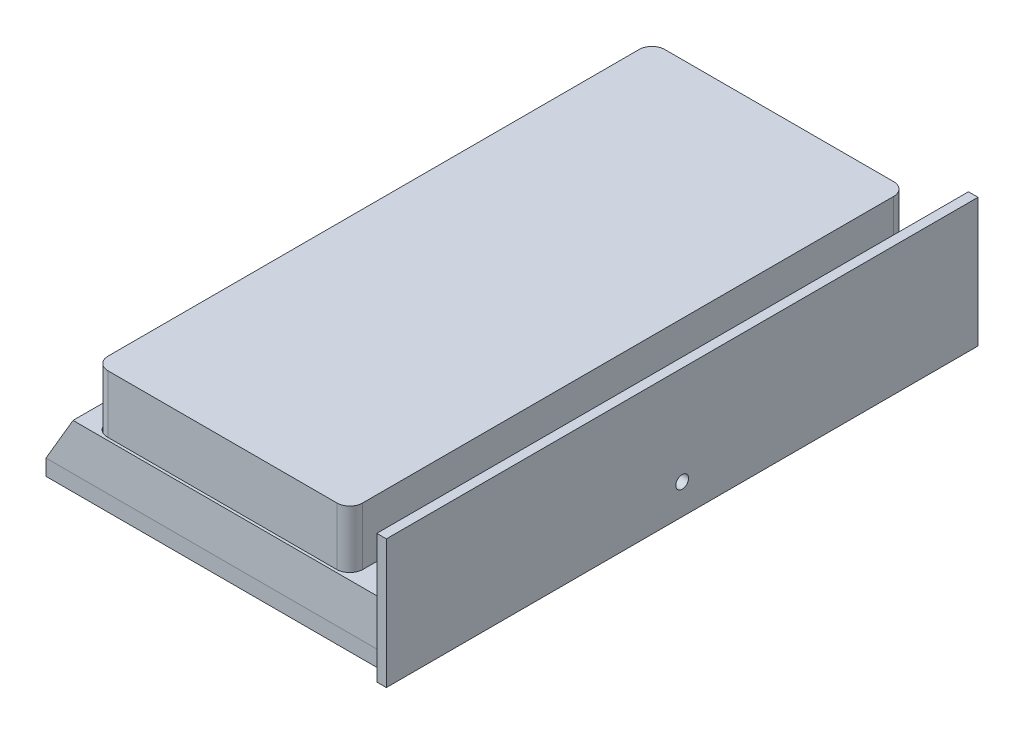
ISO-10303-21;
HEADER;
FILE_DESCRIPTION(('STEP AP214'),'2;1');
FILE_NAME('part.step','',(''),(''),'','','');
FILE_SCHEMA(('AUTOMOTIVE_DESIGN { 1 0 10303 214 1 1 1 1 }'));
ENDSEC;
DATA;
#1=APPLICATION_CONTEXT('core data for automotive mechanical design processes');
#2=APPLICATION_PROTOCOL_DEFINITION('international standard','automotive_design',2000,#1);
#3=PRODUCT_CONTEXT('',#1,'mechanical');
#4=PRODUCT('Part','Part','',(#3));
#5=PRODUCT_RELATED_PRODUCT_CATEGORY('part','',(#4));
#6=PRODUCT_DEFINITION_FORMATION('','',#4);
#7=PRODUCT_DEFINITION_CONTEXT('part definition',#1,'design');
#8=PRODUCT_DEFINITION('design','',#6,#7);
#9=PRODUCT_DEFINITION_SHAPE('','',#8);
#10=(LENGTH_UNIT() NAMED_UNIT(*) SI_UNIT(.MILLI.,.METRE.));
#11=(NAMED_UNIT(*) PLANE_ANGLE_UNIT() SI_UNIT($,.RADIAN.));
#12=(NAMED_UNIT(*) SI_UNIT($,.STERADIAN.) SOLID_ANGLE_UNIT());
#13=UNCERTAINTY_MEASURE_WITH_UNIT(LENGTH_MEASURE(1.E-05),#10,'distance_accuracy_value','');
#14=(GEOMETRIC_REPRESENTATION_CONTEXT(3) GLOBAL_UNCERTAINTY_ASSIGNED_CONTEXT((#13)) GLOBAL_UNIT_ASSIGNED_CONTEXT((#10,
#11,#12)) REPRESENTATION_CONTEXT('',''));
#15=CARTESIAN_POINT('',(0.,0.,0.));
#16=DIRECTION('',(0.,0.,1.));
#17=DIRECTION('',(1.,0.,0.));
#18=AXIS2_PLACEMENT_3D('',#15,#16,#17);
#19=CARTESIAN_POINT('',(0.,15.,0.));
#20=DIRECTION('',(0.,1.,0.));
#21=DIRECTION('',(0.,0.,1.));
#22=AXIS2_PLACEMENT_3D('',#19,#20,#21);
#23=PLANE('',#22);
#24=DIRECTION('',(1.,0.,0.));
#25=VECTOR('',#24,1.);
#26=CARTESIAN_POINT('',(54.,15.,88.5));
#27=LINE('',#26,#25);
#28=CARTESIAN_POINT('',(-46.,15.,88.5));
#29=VERTEX_POINT('',#28);
#30=CARTESIAN_POINT('',(50.,15.,88.5));
#31=VERTEX_POINT('',#30);
#32=EDGE_CURVE('E291',#29,#31,#27,.T.);
#33=ORIENTED_EDGE('',*,*,#32,.T.);
#34=DIRECTION('',(0.,0.,-1.));
#35=VECTOR('',#34,1.);
#36=CARTESIAN_POINT('',(50.,15.,-88.5));
#37=LINE('',#36,#35);
#38=CARTESIAN_POINT('',(50.,15.,-88.5));
#39=VERTEX_POINT('',#38);
#40=EDGE_CURVE('E314',#31,#39,#37,.T.);
#41=ORIENTED_EDGE('',*,*,#40,.T.);
#42=DIRECTION('',(-1.,0.,0.));
#43=VECTOR('',#42,1.);
#44=CARTESIAN_POINT('',(-54.,15.,-88.5));
#45=LINE('',#44,#43);
#46=CARTESIAN_POINT('',(-46.,15.,-88.5));
#47=VERTEX_POINT('',#46);
#48=EDGE_CURVE('E294',#39,#47,#45,.T.);
#49=ORIENTED_EDGE('',*,*,#48,.T.);
#50=DIRECTION('',(0.,0.,1.));
#51=VECTOR('',#50,1.);
#52=CARTESIAN_POINT('',(-46.,15.,88.5));
#53=LINE('',#52,#51);
#54=EDGE_CURVE('E303',#47,#29,#53,.T.);
#55=ORIENTED_EDGE('',*,*,#54,.T.);
#56=EDGE_LOOP('',(#33,#41,#49,#55));
#57=FACE_BOUND('',#56,.T.);
#58=DIRECTION('',(-1.,0.,0.));
#59=VECTOR('',#58,1.);
#60=CARTESIAN_POINT('',(36.,15.,-87.65));
#61=LINE('',#60,#59);
#62=CARTESIAN_POINT('',(36.,15.,-87.65));
#63=VERTEX_POINT('',#62);
#64=CARTESIAN_POINT('',(-36.,15.,-87.65));
#65=VERTEX_POINT('',#64);
#66=EDGE_CURVE('E225',#63,#65,#61,.T.);
#67=ORIENTED_EDGE('',*,*,#66,.F.);
#68=CARTESIAN_POINT('',(36.,15.,-83.5));
#69=DIRECTION('',(0.,1.,0.));
#70=DIRECTION('',(0.,0.,1.));
#71=AXIS2_PLACEMENT_3D('',#68,#69,#70);
#72=CIRCLE('',#71,4.14999999999999);
#73=CARTESIAN_POINT('',(40.15,15.,-83.5));
#74=VERTEX_POINT('',#73);
#75=EDGE_CURVE('E223',#74,#63,#72,.T.);
#76=ORIENTED_EDGE('',*,*,#75,.F.);
#77=DIRECTION('',(0.,0.,-1.));
#78=VECTOR('',#77,1.);
#79=CARTESIAN_POINT('',(40.15,15.,83.5));
#80=LINE('',#79,#78);
#81=CARTESIAN_POINT('',(40.15,15.,83.5));
#82=VERTEX_POINT('',#81);
#83=EDGE_CURVE('E239',#82,#74,#80,.T.);
#84=ORIENTED_EDGE('',*,*,#83,.F.);
#85=CARTESIAN_POINT('',(36.,15.,83.5));
#86=DIRECTION('',(0.,1.,0.));
#87=DIRECTION('',(0.,0.,1.));
#88=AXIS2_PLACEMENT_3D('',#85,#86,#87);
#89=CIRCLE('',#88,4.15);
#90=CARTESIAN_POINT('',(36.,15.,87.65));
#91=VERTEX_POINT('',#90);
#92=EDGE_CURVE('E236',#91,#82,#89,.T.);
#93=ORIENTED_EDGE('',*,*,#92,.F.);
#94=DIRECTION('',(1.,0.,0.));
#95=VECTOR('',#94,1.);
#96=CARTESIAN_POINT('',(-36.,15.,87.65));
#97=LINE('',#96,#95);
#98=CARTESIAN_POINT('',(-36.,15.,87.65));
#99=VERTEX_POINT('',#98);
#100=EDGE_CURVE('E234',#99,#91,#97,.T.);
#101=ORIENTED_EDGE('',*,*,#100,.F.);
#102=CARTESIAN_POINT('',(-36.,15.,83.5));
#103=DIRECTION('',(0.,1.,0.));
#104=DIRECTION('',(0.,0.,1.));
#105=AXIS2_PLACEMENT_3D('',#102,#103,#104);
#106=CIRCLE('',#105,4.15);
#107=CARTESIAN_POINT('',(-40.15,15.,83.5));
#108=VERTEX_POINT('',#107);
#109=EDGE_CURVE('E232',#108,#99,#106,.T.);
#110=ORIENTED_EDGE('',*,*,#109,.F.);
#111=DIRECTION('',(0.,0.,1.));
#112=VECTOR('',#111,1.);
#113=CARTESIAN_POINT('',(-40.15,15.,-83.5));
#114=LINE('',#113,#112);
#115=CARTESIAN_POINT('',(-40.15,15.,-83.5));
#116=VERTEX_POINT('',#115);
#117=EDGE_CURVE('E230',#116,#108,#114,.T.);
#118=ORIENTED_EDGE('',*,*,#117,.F.);
#119=CARTESIAN_POINT('',(-36.,15.,-83.5));
#120=DIRECTION('',(0.,1.,0.));
#121=DIRECTION('',(0.,0.,1.));
#122=AXIS2_PLACEMENT_3D('',#119,#120,#121);
#123=CIRCLE('',#122,4.15);
#124=EDGE_CURVE('E228',#65,#116,#123,.T.);
#125=ORIENTED_EDGE('',*,*,#124,.F.);
#126=EDGE_LOOP('',(#67,#76,#84,#93,#101,#110,#118,#125));
#127=FACE_BOUND('',#126,.T.);
#128=ADVANCED_FACE('F49',(#57,#127),#23,.T.);
#129=CARTESIAN_POINT('',(-54.,15.,-89.));
#130=DIRECTION('',(0.,0.,1.));
#131=DIRECTION('',(1.,0.,0.));
#132=AXIS2_PLACEMENT_3D('',#129,#130,#131);
#133=PLANE('',#132);
#134=DIRECTION('',(0.,-1.,0.));
#135=VECTOR('',#134,1.);
#136=CARTESIAN_POINT('',(-54.,15.,-89.));
#137=LINE('',#136,#135);
#138=CARTESIAN_POINT('',(-54.,0.999999999998544,-89.));
#139=VERTEX_POINT('',#138);
#140=CARTESIAN_POINT('',(-54.,-4.,-89.));
#141=VERTEX_POINT('',#140);
#142=EDGE_CURVE('E287',#139,#141,#137,.T.);
#143=ORIENTED_EDGE('',*,*,#142,.F.);
#144=DIRECTION('',(1.,0.,0.));
#145=VECTOR('',#144,1.);
#146=CARTESIAN_POINT('',(54.,0.999999999998544,-89.));
#147=LINE('',#146,#145);
#148=CARTESIAN_POINT('',(54.,0.999999999998544,-89.));
#149=VERTEX_POINT('',#148);
#150=EDGE_CURVE('E296',#139,#149,#147,.T.);
#151=ORIENTED_EDGE('',*,*,#150,.T.);
#152=DIRECTION('',(0.,-1.,0.));
#153=VECTOR('',#152,1.);
#154=CARTESIAN_POINT('',(54.,15.,-89.));
#155=LINE('',#154,#153);
#156=CARTESIAN_POINT('',(54.,-4.,-89.));
#157=VERTEX_POINT('',#156);
#158=EDGE_CURVE('E289',#149,#157,#155,.T.);
#159=ORIENTED_EDGE('',*,*,#158,.T.);
#160=DIRECTION('',(1.,0.,0.));
#161=VECTOR('',#160,1.);
#162=CARTESIAN_POINT('',(-54.,-4.,-89.));
#163=LINE('',#162,#161);
#164=EDGE_CURVE('E208',#141,#157,#163,.T.);
#165=ORIENTED_EDGE('',*,*,#164,.F.);
#166=EDGE_LOOP('',(#143,#151,#159,#165));
#167=FACE_BOUND('',#166,.T.);
#168=ADVANCED_FACE('F369',(#167),#133,.F.);
#169=CARTESIAN_POINT('',(-54.,15.,-89.));
#170=DIRECTION('',(1.,0.,0.));
#171=DIRECTION('',(0.,0.,-1.));
#172=AXIS2_PLACEMENT_3D('',#169,#170,#171);
#173=PLANE('',#172);
#174=DIRECTION('',(0.,-1.,0.));
#175=VECTOR('',#174,1.);
#176=CARTESIAN_POINT('',(-54.,15.,89.));
#177=LINE('',#176,#175);
#178=CARTESIAN_POINT('',(-54.,0.999999999998544,89.));
#179=VERTEX_POINT('',#178);
#180=CARTESIAN_POINT('',(-54.,-4.,89.));
#181=VERTEX_POINT('',#180);
#182=EDGE_CURVE('E285',#179,#181,#177,.T.);
#183=ORIENTED_EDGE('',*,*,#182,.F.);
#184=DIRECTION('',(0.,0.,-1.));
#185=VECTOR('',#184,1.);
#186=CARTESIAN_POINT('',(-54.,0.999999999999902,-88.5));
#187=LINE('',#186,#185);
#188=EDGE_CURVE('E308',#179,#139,#187,.T.);
#189=ORIENTED_EDGE('',*,*,#188,.T.);
#190=ORIENTED_EDGE('',*,*,#142,.T.);
#191=DIRECTION('',(0.,0.,-1.));
#192=VECTOR('',#191,1.);
#193=CARTESIAN_POINT('',(-54.,-4.,89.));
#194=LINE('',#193,#192);
#195=EDGE_CURVE('E218',#181,#141,#194,.T.);
#196=ORIENTED_EDGE('',*,*,#195,.F.);
#197=EDGE_LOOP('',(#183,#189,#190,#196));
#198=FACE_BOUND('',#197,.T.);
#199=ADVANCED_FACE('F375',(#198),#173,.F.);
#200=CARTESIAN_POINT('',(-54.,15.,89.));
#201=DIRECTION('',(0.,0.,-1.));
#202=DIRECTION('',(-1.,0.,0.));
#203=AXIS2_PLACEMENT_3D('',#200,#201,#202);
#204=PLANE('',#203);
#205=DIRECTION('',(0.,-1.,0.));
#206=VECTOR('',#205,1.);
#207=CARTESIAN_POINT('',(54.,15.,89.));
#208=LINE('',#207,#206);
#209=CARTESIAN_POINT('',(54.,0.999999999998544,89.));
#210=VERTEX_POINT('',#209);
#211=CARTESIAN_POINT('',(54.,-4.,89.));
#212=VERTEX_POINT('',#211);
#213=EDGE_CURVE('E282',#210,#212,#208,.T.);
#214=ORIENTED_EDGE('',*,*,#213,.F.);
#215=DIRECTION('',(-1.,0.,0.));
#216=VECTOR('',#215,1.);
#217=CARTESIAN_POINT('',(-54.,0.999999999998544,89.));
#218=LINE('',#217,#216);
#219=EDGE_CURVE('E300',#210,#179,#218,.T.);
#220=ORIENTED_EDGE('',*,*,#219,.T.);
#221=ORIENTED_EDGE('',*,*,#182,.T.);
#222=DIRECTION('',(-1.,0.,0.));
#223=VECTOR('',#222,1.);
#224=CARTESIAN_POINT('',(54.,-4.,89.));
#225=LINE('',#224,#223);
#226=EDGE_CURVE('E210',#212,#181,#225,.T.);
#227=ORIENTED_EDGE('',*,*,#226,.F.);
#228=EDGE_LOOP('',(#214,#220,#221,#227));
#229=FACE_BOUND('',#228,.T.);
#230=ADVANCED_FACE('F383',(#229),#204,.F.);
#231=CARTESIAN_POINT('',(36.,15.,-83.5));
#232=DIRECTION('',(0.,-1.,0.));
#233=DIRECTION('',(0.,0.,-1.));
#234=AXIS2_PLACEMENT_3D('',#231,#232,#233);
#235=CYLINDRICAL_SURFACE('',#234,4.14999999999999);
#236=CARTESIAN_POINT('',(36.,0.,-83.5));
#237=DIRECTION('',(0.,1.,0.));
#238=DIRECTION('',(0.,0.,1.));
#239=AXIS2_PLACEMENT_3D('',#236,#237,#238);
#240=CIRCLE('',#239,4.14999999999999);
#241=CARTESIAN_POINT('',(40.15,0.,-83.5));
#242=VERTEX_POINT('',#241);
#243=CARTESIAN_POINT('',(36.,0.,-87.65));
#244=VERTEX_POINT('',#243);
#245=EDGE_CURVE('E222',#242,#244,#240,.T.);
#246=ORIENTED_EDGE('',*,*,#245,.F.);
#247=DIRECTION('',(0.,-1.,0.));
#248=VECTOR('',#247,1.);
#249=CARTESIAN_POINT('',(40.15,15.,-83.5));
#250=LINE('',#249,#248);
#251=EDGE_CURVE('E242',#74,#242,#250,.T.);
#252=ORIENTED_EDGE('',*,*,#251,.F.);
#253=ORIENTED_EDGE('',*,*,#75,.T.);
#254=DIRECTION('',(0.,-1.,0.));
#255=VECTOR('',#254,1.);
#256=CARTESIAN_POINT('',(36.,15.,-87.65));
#257=LINE('',#256,#255);
#258=EDGE_CURVE('E279',#63,#244,#257,.T.);
#259=ORIENTED_EDGE('',*,*,#258,.T.);
#260=EDGE_LOOP('',(#246,#252,#253,#259));
#261=FACE_BOUND('',#260,.T.);
#262=ADVANCED_FACE('F381',(#261),#235,.F.);
#263=CARTESIAN_POINT('',(36.,15.,-87.65));
#264=DIRECTION('',(0.,0.,1.));
#265=DIRECTION('',(1.,0.,0.));
#266=AXIS2_PLACEMENT_3D('',#263,#264,#265);
#267=PLANE('',#266);
#268=DIRECTION('',(-1.,0.,0.));
#269=VECTOR('',#268,1.);
#270=CARTESIAN_POINT('',(36.,0.,-87.65));
#271=LINE('',#270,#269);
#272=CARTESIAN_POINT('',(-36.,0.,-87.65));
#273=VERTEX_POINT('',#272);
#274=EDGE_CURVE('E245',#244,#273,#271,.T.);
#275=ORIENTED_EDGE('',*,*,#274,.F.);
#276=ORIENTED_EDGE('',*,*,#258,.F.);
#277=ORIENTED_EDGE('',*,*,#66,.T.);
#278=DIRECTION('',(0.,-1.,0.));
#279=VECTOR('',#278,1.);
#280=CARTESIAN_POINT('',(-36.,15.,-87.65));
#281=LINE('',#280,#279);
#282=EDGE_CURVE('E277',#65,#273,#281,.T.);
#283=ORIENTED_EDGE('',*,*,#282,.T.);
#284=EDGE_LOOP('',(#275,#276,#277,#283));
#285=FACE_BOUND('',#284,.T.);
#286=ADVANCED_FACE('F498',(#285),#267,.T.);
#287=CARTESIAN_POINT('',(-36.,15.,-83.5));
#288=DIRECTION('',(0.,-1.,0.));
#289=DIRECTION('',(0.,0.,-1.));
#290=AXIS2_PLACEMENT_3D('',#287,#288,#289);
#291=CYLINDRICAL_SURFACE('',#290,4.15);
#292=CARTESIAN_POINT('',(-36.,0.,-83.5));
#293=DIRECTION('',(0.,1.,0.));
#294=DIRECTION('',(0.,0.,1.));
#295=AXIS2_PLACEMENT_3D('',#292,#293,#294);
#296=CIRCLE('',#295,4.15);
#297=CARTESIAN_POINT('',(-40.15,0.,-83.5));
#298=VERTEX_POINT('',#297);
#299=EDGE_CURVE('E248',#273,#298,#296,.T.);
#300=ORIENTED_EDGE('',*,*,#299,.F.);
#301=ORIENTED_EDGE('',*,*,#282,.F.);
#302=ORIENTED_EDGE('',*,*,#124,.T.);
#303=DIRECTION('',(0.,-1.,0.));
#304=VECTOR('',#303,1.);
#305=CARTESIAN_POINT('',(-40.15,15.,-83.5));
#306=LINE('',#305,#304);
#307=EDGE_CURVE('E275',#116,#298,#306,.T.);
#308=ORIENTED_EDGE('',*,*,#307,.T.);
#309=EDGE_LOOP('',(#300,#301,#302,#308));
#310=FACE_BOUND('',#309,.T.);
#311=ADVANCED_FACE('F490',(#310),#291,.F.);
#312=CARTESIAN_POINT('',(-40.15,15.,-83.5));
#313=DIRECTION('',(1.,0.,0.));
#314=DIRECTION('',(0.,0.,-1.));
#315=AXIS2_PLACEMENT_3D('',#312,#313,#314);
#316=PLANE('',#315);
#317=DIRECTION('',(0.,0.,1.));
#318=VECTOR('',#317,1.);
#319=CARTESIAN_POINT('',(-40.15,0.,-83.5));
#320=LINE('',#319,#318);
#321=CARTESIAN_POINT('',(-40.15,0.,83.5));
#322=VERTEX_POINT('',#321);
#323=EDGE_CURVE('E251',#298,#322,#320,.T.);
#324=ORIENTED_EDGE('',*,*,#323,.F.);
#325=ORIENTED_EDGE('',*,*,#307,.F.);
#326=ORIENTED_EDGE('',*,*,#117,.T.);
#327=DIRECTION('',(0.,-1.,0.));
#328=VECTOR('',#327,1.);
#329=CARTESIAN_POINT('',(-40.15,15.,83.5));
#330=LINE('',#329,#328);
#331=EDGE_CURVE('E273',#108,#322,#330,.T.);
#332=ORIENTED_EDGE('',*,*,#331,.T.);
#333=EDGE_LOOP('',(#324,#325,#326,#332));
#334=FACE_BOUND('',#333,.T.);
#335=ADVANCED_FACE('F482',(#334),#316,.T.);
#336=CARTESIAN_POINT('',(-36.,15.,83.5));
#337=DIRECTION('',(0.,-1.,0.));
#338=DIRECTION('',(0.,0.,-1.));
#339=AXIS2_PLACEMENT_3D('',#336,#337,#338);
#340=CYLINDRICAL_SURFACE('',#339,4.15);
#341=CARTESIAN_POINT('',(-36.,0.,83.5));
#342=DIRECTION('',(0.,1.,0.));
#343=DIRECTION('',(0.,0.,1.));
#344=AXIS2_PLACEMENT_3D('',#341,#342,#343);
#345=CIRCLE('',#344,4.15);
#346=CARTESIAN_POINT('',(-36.,0.,87.65));
#347=VERTEX_POINT('',#346);
#348=EDGE_CURVE('E255',#322,#347,#345,.T.);
#349=ORIENTED_EDGE('',*,*,#348,.F.);
#350=ORIENTED_EDGE('',*,*,#331,.F.);
#351=ORIENTED_EDGE('',*,*,#109,.T.);
#352=DIRECTION('',(0.,-1.,0.));
#353=VECTOR('',#352,1.);
#354=CARTESIAN_POINT('',(-36.,15.,87.65));
#355=LINE('',#354,#353);
#356=EDGE_CURVE('E271',#99,#347,#355,.T.);
#357=ORIENTED_EDGE('',*,*,#356,.T.);
#358=EDGE_LOOP('',(#349,#350,#351,#357));
#359=FACE_BOUND('',#358,.T.);
#360=ADVANCED_FACE('F474',(#359),#340,.F.);
#361=CARTESIAN_POINT('',(-36.,15.,87.65));
#362=DIRECTION('',(0.,0.,-1.));
#363=DIRECTION('',(-1.,0.,0.));
#364=AXIS2_PLACEMENT_3D('',#361,#362,#363);
#365=PLANE('',#364);
#366=DIRECTION('',(1.,0.,0.));
#367=VECTOR('',#366,1.);
#368=CARTESIAN_POINT('',(-36.,0.,87.65));
#369=LINE('',#368,#367);
#370=CARTESIAN_POINT('',(36.,0.,87.65));
#371=VERTEX_POINT('',#370);
#372=EDGE_CURVE('E258',#347,#371,#369,.T.);
#373=ORIENTED_EDGE('',*,*,#372,.F.);
#374=ORIENTED_EDGE('',*,*,#356,.F.);
#375=ORIENTED_EDGE('',*,*,#100,.T.);
#376=DIRECTION('',(0.,-1.,0.));
#377=VECTOR('',#376,1.);
#378=CARTESIAN_POINT('',(36.,15.,87.65));
#379=LINE('',#378,#377);
#380=EDGE_CURVE('E269',#91,#371,#379,.T.);
#381=ORIENTED_EDGE('',*,*,#380,.T.);
#382=EDGE_LOOP('',(#373,#374,#375,#381));
#383=FACE_BOUND('',#382,.T.);
#384=ADVANCED_FACE('F466',(#383),#365,.T.);
#385=CARTESIAN_POINT('',(36.,15.,83.5));
#386=DIRECTION('',(0.,-1.,0.));
#387=DIRECTION('',(0.,0.,-1.));
#388=AXIS2_PLACEMENT_3D('',#385,#386,#387);
#389=CYLINDRICAL_SURFACE('',#388,4.15);
#390=CARTESIAN_POINT('',(36.,0.,83.5));
#391=DIRECTION('',(0.,1.,0.));
#392=DIRECTION('',(0.,0.,1.));
#393=AXIS2_PLACEMENT_3D('',#390,#391,#392);
#394=CIRCLE('',#393,4.15);
#395=CARTESIAN_POINT('',(40.15,0.,83.5));
#396=VERTEX_POINT('',#395);
#397=EDGE_CURVE('E261',#371,#396,#394,.T.);
#398=ORIENTED_EDGE('',*,*,#397,.F.);
#399=ORIENTED_EDGE('',*,*,#380,.F.);
#400=ORIENTED_EDGE('',*,*,#92,.T.);
#401=DIRECTION('',(0.,-1.,0.));
#402=VECTOR('',#401,1.);
#403=CARTESIAN_POINT('',(40.15,15.,83.5));
#404=LINE('',#403,#402);
#405=EDGE_CURVE('E267',#82,#396,#404,.T.);
#406=ORIENTED_EDGE('',*,*,#405,.T.);
#407=EDGE_LOOP('',(#398,#399,#400,#406));
#408=FACE_BOUND('',#407,.T.);
#409=ADVANCED_FACE('F458',(#408),#389,.F.);
#410=CARTESIAN_POINT('',(40.15,15.,83.5));
#411=DIRECTION('',(-1.,0.,0.));
#412=DIRECTION('',(0.,0.,1.));
#413=AXIS2_PLACEMENT_3D('',#410,#411,#412);
#414=PLANE('',#413);
#415=DIRECTION('',(0.,0.,-1.));
#416=VECTOR('',#415,1.);
#417=CARTESIAN_POINT('',(40.15,0.,83.5));
#418=LINE('',#417,#416);
#419=EDGE_CURVE('E226',#396,#242,#418,.T.);
#420=ORIENTED_EDGE('',*,*,#419,.F.);
#421=ORIENTED_EDGE('',*,*,#405,.F.);
#422=ORIENTED_EDGE('',*,*,#83,.T.);
#423=ORIENTED_EDGE('',*,*,#251,.T.);
#424=EDGE_LOOP('',(#420,#421,#422,#423));
#425=FACE_BOUND('',#424,.T.);
#426=ADVANCED_FACE('F447',(#425),#414,.T.);
#427=CARTESIAN_POINT('',(0.,0.,0.));
#428=DIRECTION('',(0.,-1.,0.));
#429=DIRECTION('',(0.,0.,-1.));
#430=AXIS2_PLACEMENT_3D('',#427,#428,#429);
#431=PLANE('',#430);
#432=ORIENTED_EDGE('',*,*,#419,.T.);
#433=ORIENTED_EDGE('',*,*,#245,.T.);
#434=ORIENTED_EDGE('',*,*,#274,.T.);
#435=ORIENTED_EDGE('',*,*,#299,.T.);
#436=ORIENTED_EDGE('',*,*,#323,.T.);
#437=ORIENTED_EDGE('',*,*,#348,.T.);
#438=ORIENTED_EDGE('',*,*,#372,.T.);
#439=ORIENTED_EDGE('',*,*,#397,.T.);
#440=EDGE_LOOP('',(#432,#433,#434,#435,#436,#437,#438,#439));
#441=FACE_BOUND('',#440,.T.);
#442=ADVANCED_FACE('F438',(#441),#431,.F.);
#443=CARTESIAN_POINT('',(0.,-4.,0.));
#444=DIRECTION('',(0.,-1.,0.));
#445=DIRECTION('',(0.,0.,-1.));
#446=AXIS2_PLACEMENT_3D('',#443,#444,#445);
#447=PLANE('',#446);
#448=ORIENTED_EDGE('',*,*,#164,.T.);
#449=DIRECTION('',(0.,0.,-1.));
#450=VECTOR('',#449,1.);
#451=CARTESIAN_POINT('',(54.,-4.,93.));
#452=LINE('',#451,#450);
#453=CARTESIAN_POINT('',(54.,-3.99999999999998,-93.));
#454=VERTEX_POINT('',#453);
#455=EDGE_CURVE('E332',#157,#454,#452,.T.);
#456=ORIENTED_EDGE('',*,*,#455,.T.);
#457=DIRECTION('',(-1.,0.,0.));
#458=VECTOR('',#457,1.);
#459=CARTESIAN_POINT('',(57.,-3.99999999999998,-93.));
#460=LINE('',#459,#458);
#461=CARTESIAN_POINT('',(57.,-3.99999999999998,-93.));
#462=VERTEX_POINT('',#461);
#463=EDGE_CURVE('E190',#462,#454,#460,.T.);
#464=ORIENTED_EDGE('',*,*,#463,.F.);
#465=DIRECTION('',(0.,0.,-1.));
#466=VECTOR('',#465,1.);
#467=CARTESIAN_POINT('',(57.,-4.,93.));
#468=LINE('',#467,#466);
#469=CARTESIAN_POINT('',(57.,-4.,93.));
#470=VERTEX_POINT('',#469);
#471=EDGE_CURVE('E181',#470,#462,#468,.T.);
#472=ORIENTED_EDGE('',*,*,#471,.F.);
#473=DIRECTION('',(-1.,0.,0.));
#474=VECTOR('',#473,1.);
#475=CARTESIAN_POINT('',(57.,-4.,93.));
#476=LINE('',#475,#474);
#477=CARTESIAN_POINT('',(54.,-4.,93.));
#478=VERTEX_POINT('',#477);
#479=EDGE_CURVE('E187',#470,#478,#476,.T.);
#480=ORIENTED_EDGE('',*,*,#479,.T.);
#481=EDGE_CURVE('E328',#478,#212,#452,.T.);
#482=ORIENTED_EDGE('',*,*,#481,.T.);
#483=ORIENTED_EDGE('',*,*,#226,.T.);
#484=ORIENTED_EDGE('',*,*,#195,.T.);
#485=EDGE_LOOP('',(#448,#456,#464,#472,#480,#482,#483,#484));
#486=FACE_BOUND('',#485,.T.);
#487=ADVANCED_FACE('F184',(#486),#447,.T.);
#488=CARTESIAN_POINT('',(0.,15.,-88.5));
#489=DIRECTION('',(0.,0.0356915305124088,-0.99936285434755));
#490=DIRECTION('',(1.,0.,0.));
#491=AXIS2_PLACEMENT_3D('',#488,#489,#490);
#492=PLANE('',#491);
#493=ORIENTED_EDGE('',*,*,#150,.F.);
#494=DIRECTION('',(0.495900581898993,0.867826018323242,0.030993786368684));
#495=VECTOR('',#494,1.);
#496=CARTESIAN_POINT('',(-34.687800192123,34.7963496637848,-87.7929875120078));
#497=LINE('',#496,#495);
#498=EDGE_CURVE('E311',#139,#47,#497,.T.);
#499=ORIENTED_EDGE('',*,*,#498,.T.);
#500=ORIENTED_EDGE('',*,*,#48,.F.);
#501=DIRECTION('',(-0.228901050796831,-0.972829465886516,-0.0347439094959434));
#502=VECTOR('',#501,1.);
#503=CARTESIAN_POINT('',(50.7038331892284,17.9912910542207,-88.393168176635));
#504=LINE('',#503,#502);
#505=CARTESIAN_POINT('',(54.,31.9999999999997,-87.8928571428572));
#506=VERTEX_POINT('',#505);
#507=EDGE_CURVE('E57',#39,#506,#504,.F.);
#508=ORIENTED_EDGE('',*,*,#507,.T.);
#509=DIRECTION('',(0.,0.99936285434755,0.0356915305124088));
#510=VECTOR('',#509,1.);
#511=CARTESIAN_POINT('',(54.,15.,-88.5));
#512=LINE('',#511,#510);
#513=EDGE_CURVE('E64',#149,#506,#512,.T.);
#514=ORIENTED_EDGE('',*,*,#513,.F.);
#515=EDGE_LOOP('',(#493,#499,#500,#508,#514));
#516=FACE_BOUND('',#515,.T.);
#517=ADVANCED_FACE('F323',(#516),#492,.T.);
#518=CARTESIAN_POINT('',(0.,15.,88.5));
#519=DIRECTION('',(0.,0.0356915305124088,0.99936285434755));
#520=DIRECTION('',(-1.,0.,0.));
#521=AXIS2_PLACEMENT_3D('',#518,#519,#520);
#522=PLANE('',#521);
#523=ORIENTED_EDGE('',*,*,#32,.F.);
#524=DIRECTION('',(-0.495900581898993,-0.867826018323242,0.030993786368684));
#525=VECTOR('',#524,1.);
#526=CARTESIAN_POINT('',(-34.687800192123,34.7963496637848,87.7929875120078));
#527=LINE('',#526,#525);
#528=EDGE_CURVE('E306',#29,#179,#527,.T.);
#529=ORIENTED_EDGE('',*,*,#528,.T.);
#530=ORIENTED_EDGE('',*,*,#219,.F.);
#531=DIRECTION('',(0.,-0.99936285434755,0.0356915305124088));
#532=VECTOR('',#531,1.);
#533=CARTESIAN_POINT('',(54.,15.,88.5));
#534=LINE('',#533,#532);
#535=CARTESIAN_POINT('',(54.,31.9999999999997,87.8928571428572));
#536=VERTEX_POINT('',#535);
#537=EDGE_CURVE('E71',#536,#210,#534,.T.);
#538=ORIENTED_EDGE('',*,*,#537,.F.);
#539=DIRECTION('',(0.228901050796831,0.972829465886516,-0.0347439094959434));
#540=VECTOR('',#539,1.);
#541=CARTESIAN_POINT('',(50.7038331892284,17.9912910542207,88.393168176635));
#542=LINE('',#541,#540);
#543=EDGE_CURVE('E12',#536,#31,#542,.F.);
#544=ORIENTED_EDGE('',*,*,#543,.T.);
#545=EDGE_LOOP('',(#523,#529,#530,#538,#544));
#546=FACE_BOUND('',#545,.T.);
#547=ADVANCED_FACE('F391',(#546),#522,.T.);
#548=CARTESIAN_POINT('',(-46.,15.,0.));
#549=DIRECTION('',(-0.86824314212446,0.496138938356832,0.));
#550=DIRECTION('',(0.,0.,-1.));
#551=AXIS2_PLACEMENT_3D('',#548,#549,#550);
#552=PLANE('',#551);
#553=ORIENTED_EDGE('',*,*,#498,.F.);
#554=ORIENTED_EDGE('',*,*,#188,.F.);
#555=ORIENTED_EDGE('',*,*,#528,.F.);
#556=ORIENTED_EDGE('',*,*,#54,.F.);
#557=EDGE_LOOP('',(#553,#554,#555,#556));
#558=FACE_BOUND('',#557,.T.);
#559=ADVANCED_FACE('F393',(#558),#552,.T.);
#560=CARTESIAN_POINT('',(54.,0.,0.));
#561=DIRECTION('',(-1.,0.,0.));
#562=DIRECTION('',(0.,0.,1.));
#563=AXIS2_PLACEMENT_3D('',#560,#561,#562);
#564=PLANE('',#563);
#565=ORIENTED_EDGE('',*,*,#513,.T.);
#566=DIRECTION('',(0.,0.,1.));
#567=VECTOR('',#566,1.);
#568=CARTESIAN_POINT('',(54.,31.9999999999997,88.5));
#569=LINE('',#568,#567);
#570=EDGE_CURVE('E317',#506,#536,#569,.T.);
#571=ORIENTED_EDGE('',*,*,#570,.T.);
#572=ORIENTED_EDGE('',*,*,#537,.T.);
#573=ORIENTED_EDGE('',*,*,#213,.T.);
#574=ORIENTED_EDGE('',*,*,#481,.F.);
#575=DIRECTION('',(0.,-1.,0.));
#576=VECTOR('',#575,1.);
#577=CARTESIAN_POINT('',(54.,-4.,93.));
#578=LINE('',#577,#576);
#579=CARTESIAN_POINT('',(54.,36.5,93.));
#580=VERTEX_POINT('',#579);
#581=EDGE_CURVE('E207',#580,#478,#578,.T.);
#582=ORIENTED_EDGE('',*,*,#581,.F.);
#583=DIRECTION('',(0.,0.,1.));
#584=VECTOR('',#583,1.);
#585=CARTESIAN_POINT('',(54.,36.5,93.));
#586=LINE('',#585,#584);
#587=CARTESIAN_POINT('',(54.,36.5,-93.));
#588=VERTEX_POINT('',#587);
#589=EDGE_CURVE('E203',#588,#580,#586,.T.);
#590=ORIENTED_EDGE('',*,*,#589,.F.);
#591=DIRECTION('',(0.,1.,0.));
#592=VECTOR('',#591,1.);
#593=CARTESIAN_POINT('',(54.,-3.99999999999998,-93.));
#594=LINE('',#593,#592);
#595=EDGE_CURVE('E331',#454,#588,#594,.T.);
#596=ORIENTED_EDGE('',*,*,#595,.F.);
#597=ORIENTED_EDGE('',*,*,#455,.F.);
#598=ORIENTED_EDGE('',*,*,#158,.F.);
#599=EDGE_LOOP('',(#565,#571,#572,#573,#574,#582,#590,#596,#597,#598));
#600=FACE_BOUND('',#599,.T.);
#601=ADVANCED_FACE('F327',(#600),#564,.T.);
#602=CARTESIAN_POINT('',(57.,-4.,93.));
#603=DIRECTION('',(0.,0.,-1.));
#604=DIRECTION('',(-1.,0.,0.));
#605=AXIS2_PLACEMENT_3D('',#602,#603,#604);
#606=PLANE('',#605);
#607=ORIENTED_EDGE('',*,*,#581,.T.);
#608=ORIENTED_EDGE('',*,*,#479,.F.);
#609=DIRECTION('',(0.,-1.,0.));
#610=VECTOR('',#609,1.);
#611=CARTESIAN_POINT('',(57.,-4.,93.));
#612=LINE('',#611,#610);
#613=CARTESIAN_POINT('',(57.,36.5,93.));
#614=VERTEX_POINT('',#613);
#615=EDGE_CURVE('E194',#614,#470,#612,.T.);
#616=ORIENTED_EDGE('',*,*,#615,.F.);
#617=DIRECTION('',(-1.,0.,0.));
#618=VECTOR('',#617,1.);
#619=CARTESIAN_POINT('',(57.,36.5,93.));
#620=LINE('',#619,#618);
#621=EDGE_CURVE('E340',#614,#580,#620,.T.);
#622=ORIENTED_EDGE('',*,*,#621,.T.);
#623=EDGE_LOOP('',(#607,#608,#616,#622));
#624=FACE_BOUND('',#623,.T.);
#625=ADVANCED_FACE('F205',(#624),#606,.F.);
#626=CARTESIAN_POINT('',(57.,-3.99999999999998,-93.));
#627=DIRECTION('',(0.,0.,1.));
#628=DIRECTION('',(1.,0.,0.));
#629=AXIS2_PLACEMENT_3D('',#626,#627,#628);
#630=PLANE('',#629);
#631=ORIENTED_EDGE('',*,*,#595,.T.);
#632=DIRECTION('',(-1.,0.,0.));
#633=VECTOR('',#632,1.);
#634=CARTESIAN_POINT('',(57.,36.5,-93.));
#635=LINE('',#634,#633);
#636=CARTESIAN_POINT('',(57.,36.5,-93.));
#637=VERTEX_POINT('',#636);
#638=EDGE_CURVE('E212',#637,#588,#635,.T.);
#639=ORIENTED_EDGE('',*,*,#638,.F.);
#640=DIRECTION('',(0.,1.,0.));
#641=VECTOR('',#640,1.);
#642=CARTESIAN_POINT('',(57.,-3.99999999999998,-93.));
#643=LINE('',#642,#641);
#644=EDGE_CURVE('E193',#462,#637,#643,.T.);
#645=ORIENTED_EDGE('',*,*,#644,.F.);
#646=ORIENTED_EDGE('',*,*,#463,.T.);
#647=EDGE_LOOP('',(#631,#639,#645,#646));
#648=FACE_BOUND('',#647,.T.);
#649=ADVANCED_FACE('F359',(#648),#630,.F.);
#650=CARTESIAN_POINT('',(57.,36.5,93.));
#651=DIRECTION('',(0.,-1.,0.));
#652=DIRECTION('',(0.,0.,-1.));
#653=AXIS2_PLACEMENT_3D('',#650,#651,#652);
#654=PLANE('',#653);
#655=ORIENTED_EDGE('',*,*,#589,.T.);
#656=ORIENTED_EDGE('',*,*,#621,.F.);
#657=DIRECTION('',(0.,0.,1.));
#658=VECTOR('',#657,1.);
#659=CARTESIAN_POINT('',(57.,36.5,93.));
#660=LINE('',#659,#658);
#661=EDGE_CURVE('E199',#637,#614,#660,.T.);
#662=ORIENTED_EDGE('',*,*,#661,.F.);
#663=ORIENTED_EDGE('',*,*,#638,.T.);
#664=EDGE_LOOP('',(#655,#656,#662,#663));
#665=FACE_BOUND('',#664,.T.);
#666=ADVANCED_FACE('F345',(#665),#654,.F.);
#667=CARTESIAN_POINT('',(57.,0.,0.));
#668=DIRECTION('',(-1.,0.,0.));
#669=DIRECTION('',(0.,0.,1.));
#670=AXIS2_PLACEMENT_3D('',#667,#668,#669);
#671=PLANE('',#670);
#672=CARTESIAN_POINT('',(57.,5.50000000000001,0.));
#673=DIRECTION('',(1.,0.,0.));
#674=DIRECTION('',(0.,0.,-1.));
#675=AXIS2_PLACEMENT_3D('',#672,#673,#674);
#676=CIRCLE('',#675,2.);
#677=CARTESIAN_POINT('',(57.,5.50000000000001,-2.));
#678=VERTEX_POINT('',#677);
#679=EDGE_CURVE('E351',#678,#678,#676,.T.);
#680=ORIENTED_EDGE('',*,*,#679,.F.);
#681=EDGE_LOOP('',(#680));
#682=FACE_BOUND('',#681,.T.);
#683=ORIENTED_EDGE('',*,*,#615,.T.);
#684=ORIENTED_EDGE('',*,*,#471,.T.);
#685=ORIENTED_EDGE('',*,*,#644,.T.);
#686=ORIENTED_EDGE('',*,*,#661,.T.);
#687=EDGE_LOOP('',(#683,#684,#685,#686));
#688=FACE_BOUND('',#687,.T.);
#689=ADVANCED_FACE('F197',(#682,#688),#671,.F.);
#690=CARTESIAN_POINT('',(51.,5.50000000000001,0.));
#691=DIRECTION('',(1.,0.,0.));
#692=DIRECTION('',(0.,0.,-1.));
#693=AXIS2_PLACEMENT_3D('',#690,#691,#692);
#694=CYLINDRICAL_SURFACE('',#693,2.);
#695=CARTESIAN_POINT('',(51.,5.50000000000001,0.));
#696=DIRECTION('',(1.,0.,0.));
#697=DIRECTION('',(0.,0.,-1.));
#698=AXIS2_PLACEMENT_3D('',#695,#696,#697);
#699=CIRCLE('',#698,2.);
#700=CARTESIAN_POINT('',(51.,5.50000000000001,-2.));
#701=VERTEX_POINT('',#700);
#702=EDGE_CURVE('E349',#701,#701,#699,.T.);
#703=ORIENTED_EDGE('',*,*,#702,.F.);
#704=EDGE_LOOP('',(#703));
#705=FACE_BOUND('',#704,.T.);
#706=ORIENTED_EDGE('',*,*,#679,.T.);
#707=EDGE_LOOP('',(#706));
#708=FACE_BOUND('',#707,.T.);
#709=ADVANCED_FACE('F412',(#705,#708),#694,.F.);
#710=CARTESIAN_POINT('',(51.,5.50000000000001,0.));
#711=DIRECTION('',(1.,0.,0.));
#712=DIRECTION('',(0.,0.,-1.));
#713=AXIS2_PLACEMENT_3D('',#710,#711,#712);
#714=PLANE('',#713);
#715=ORIENTED_EDGE('',*,*,#702,.T.);
#716=EDGE_LOOP('',(#715));
#717=FACE_BOUND('',#716,.T.);
#718=ADVANCED_FACE('F416',(#717),#714,.T.);
#719=CARTESIAN_POINT('',(50.,15.,0.));
#720=DIRECTION('',(-0.973417168333575,0.22903933372555,0.));
#721=DIRECTION('',(0.,0.,1.));
#722=AXIS2_PLACEMENT_3D('',#719,#720,#721);
#723=PLANE('',#722);
#724=ORIENTED_EDGE('',*,*,#543,.F.);
#725=ORIENTED_EDGE('',*,*,#570,.F.);
#726=ORIENTED_EDGE('',*,*,#507,.F.);
#727=ORIENTED_EDGE('',*,*,#40,.F.);
#728=EDGE_LOOP('',(#724,#725,#726,#727));
#729=FACE_BOUND('',#728,.T.);
#730=ADVANCED_FACE('F51',(#729),#723,.T.);
#731=CLOSED_SHELL('',(#128,#168,#199,#230,#262,#286,#311,#335,#360,#384,#409,#426,#442,#487,
#517,#547,#559,#601,#625,#649,#666,#689,#709,#718,#730));
#732=MANIFOLD_SOLID_BREP('B2',#731);
#733=CARTESIAN_POINT('',(40.,33.,-87.5));
#734=DIRECTION('',(-1.,0.,0.));
#735=DIRECTION('',(0.,0.,1.));
#736=AXIS2_PLACEMENT_3D('',#733,#734,#735);
#737=PLANE('',#736);
#738=DIRECTION('',(0.,0.,-1.));
#739=VECTOR('',#738,1.);
#740=CARTESIAN_POINT('',(40.,0.,-87.5));
#741=LINE('',#740,#739);
#742=CARTESIAN_POINT('',(40.,0.,83.5));
#743=VERTEX_POINT('',#742);
#744=CARTESIAN_POINT('',(40.,0.,-83.5));
#745=VERTEX_POINT('',#744);
#746=EDGE_CURVE('E737',#743,#745,#741,.T.);
#747=ORIENTED_EDGE('',*,*,#746,.T.);
#748=DIRECTION('',(0.,-1.,0.));
#749=VECTOR('',#748,1.);
#750=CARTESIAN_POINT('',(40.,33.,-83.5));
#751=LINE('',#750,#749);
#752=CARTESIAN_POINT('',(40.,33.,-83.5));
#753=VERTEX_POINT('',#752);
#754=EDGE_CURVE('E759',#745,#753,#751,.F.);
#755=ORIENTED_EDGE('',*,*,#754,.T.);
#756=DIRECTION('',(0.,0.,-1.));
#757=VECTOR('',#756,1.);
#758=CARTESIAN_POINT('',(40.,33.,-87.5));
#759=LINE('',#758,#757);
#760=CARTESIAN_POINT('',(40.,33.,83.5));
#761=VERTEX_POINT('',#760);
#762=EDGE_CURVE('E735',#761,#753,#759,.T.);
#763=ORIENTED_EDGE('',*,*,#762,.F.);
#764=DIRECTION('',(0.,-1.,0.));
#765=VECTOR('',#764,1.);
#766=CARTESIAN_POINT('',(40.,33.,83.5));
#767=LINE('',#766,#765);
#768=EDGE_CURVE('E756',#761,#743,#767,.T.);
#769=ORIENTED_EDGE('',*,*,#768,.T.);
#770=EDGE_LOOP('',(#747,#755,#763,#769));
#771=FACE_BOUND('',#770,.T.);
#772=ADVANCED_FACE('F640',(#771),#737,.F.);
#773=CARTESIAN_POINT('',(-40.,33.,-87.5));
#774=DIRECTION('',(0.,0.,1.));
#775=DIRECTION('',(1.,0.,0.));
#776=AXIS2_PLACEMENT_3D('',#773,#774,#775);
#777=PLANE('',#776);
#778=DIRECTION('',(-1.,0.,0.));
#779=VECTOR('',#778,1.);
#780=CARTESIAN_POINT('',(-40.,0.,-87.5));
#781=LINE('',#780,#779);
#782=CARTESIAN_POINT('',(36.,0.,-87.5));
#783=VERTEX_POINT('',#782);
#784=CARTESIAN_POINT('',(-36.,0.,-87.5));
#785=VERTEX_POINT('',#784);
#786=EDGE_CURVE('E733',#783,#785,#781,.T.);
#787=ORIENTED_EDGE('',*,*,#786,.T.);
#788=DIRECTION('',(0.,-1.,0.));
#789=VECTOR('',#788,1.);
#790=CARTESIAN_POINT('',(-36.,33.,-87.5));
#791=LINE('',#790,#789);
#792=CARTESIAN_POINT('',(-36.,33.,-87.5));
#793=VERTEX_POINT('',#792);
#794=EDGE_CURVE('E711',#785,#793,#791,.F.);
#795=ORIENTED_EDGE('',*,*,#794,.T.);
#796=DIRECTION('',(-1.,0.,0.));
#797=VECTOR('',#796,1.);
#798=CARTESIAN_POINT('',(-40.,33.,-87.5));
#799=LINE('',#798,#797);
#800=CARTESIAN_POINT('',(36.,33.,-87.5));
#801=VERTEX_POINT('',#800);
#802=EDGE_CURVE('E773',#801,#793,#799,.T.);
#803=ORIENTED_EDGE('',*,*,#802,.F.);
#804=DIRECTION('',(0.,-1.,0.));
#805=VECTOR('',#804,1.);
#806=CARTESIAN_POINT('',(36.,33.,-87.5));
#807=LINE('',#806,#805);
#808=EDGE_CURVE('E716',#801,#783,#807,.T.);
#809=ORIENTED_EDGE('',*,*,#808,.T.);
#810=EDGE_LOOP('',(#787,#795,#803,#809));
#811=FACE_BOUND('',#810,.T.);
#812=ADVANCED_FACE('F778',(#811),#777,.F.);
#813=CARTESIAN_POINT('',(-40.,33.,-87.5));
#814=DIRECTION('',(1.,0.,0.));
#815=DIRECTION('',(0.,0.,-1.));
#816=AXIS2_PLACEMENT_3D('',#813,#814,#815);
#817=PLANE('',#816);
#818=DIRECTION('',(0.,0.,1.));
#819=VECTOR('',#818,1.);
#820=CARTESIAN_POINT('',(-40.,33.,-87.5));
#821=LINE('',#820,#819);
#822=CARTESIAN_POINT('',(-40.,33.,-83.5));
#823=VERTEX_POINT('',#822);
#824=CARTESIAN_POINT('',(-40.,33.,83.5));
#825=VERTEX_POINT('',#824);
#826=EDGE_CURVE('E725',#823,#825,#821,.T.);
#827=ORIENTED_EDGE('',*,*,#826,.F.);
#828=DIRECTION('',(0.,-1.,0.));
#829=VECTOR('',#828,1.);
#830=CARTESIAN_POINT('',(-40.,33.,-83.5));
#831=LINE('',#830,#829);
#832=CARTESIAN_POINT('',(-40.,0.,-83.5));
#833=VERTEX_POINT('',#832);
#834=EDGE_CURVE('E710',#823,#833,#831,.T.);
#835=ORIENTED_EDGE('',*,*,#834,.T.);
#836=DIRECTION('',(0.,0.,1.));
#837=VECTOR('',#836,1.);
#838=CARTESIAN_POINT('',(-40.,0.,-87.5));
#839=LINE('',#838,#837);
#840=CARTESIAN_POINT('',(-40.,0.,83.5));
#841=VERTEX_POINT('',#840);
#842=EDGE_CURVE('E723',#833,#841,#839,.T.);
#843=ORIENTED_EDGE('',*,*,#842,.T.);
#844=DIRECTION('',(0.,-1.,0.));
#845=VECTOR('',#844,1.);
#846=CARTESIAN_POINT('',(-40.,33.,83.5));
#847=LINE('',#846,#845);
#848=EDGE_CURVE('E727',#841,#825,#847,.F.);
#849=ORIENTED_EDGE('',*,*,#848,.T.);
#850=EDGE_LOOP('',(#827,#835,#843,#849));
#851=FACE_BOUND('',#850,.T.);
#852=ADVANCED_FACE('F722',(#851),#817,.F.);
#853=CARTESIAN_POINT('',(-40.,33.,87.5));
#854=DIRECTION('',(0.,0.,-1.));
#855=DIRECTION('',(-1.,0.,0.));
#856=AXIS2_PLACEMENT_3D('',#853,#854,#855);
#857=PLANE('',#856);
#858=DIRECTION('',(1.,0.,0.));
#859=VECTOR('',#858,1.);
#860=CARTESIAN_POINT('',(-40.,33.,87.5));
#861=LINE('',#860,#859);
#862=CARTESIAN_POINT('',(-36.,33.,87.5));
#863=VERTEX_POINT('',#862);
#864=CARTESIAN_POINT('',(36.,33.,87.5));
#865=VERTEX_POINT('',#864);
#866=EDGE_CURVE('E741',#863,#865,#861,.T.);
#867=ORIENTED_EDGE('',*,*,#866,.F.);
#868=DIRECTION('',(0.,-1.,0.));
#869=VECTOR('',#868,1.);
#870=CARTESIAN_POINT('',(-36.,33.,87.5));
#871=LINE('',#870,#869);
#872=CARTESIAN_POINT('',(-36.,0.,87.5));
#873=VERTEX_POINT('',#872);
#874=EDGE_CURVE('E47',#863,#873,#871,.T.);
#875=ORIENTED_EDGE('',*,*,#874,.T.);
#876=DIRECTION('',(1.,0.,0.));
#877=VECTOR('',#876,1.);
#878=CARTESIAN_POINT('',(-40.,0.,87.5));
#879=LINE('',#878,#877);
#880=CARTESIAN_POINT('',(36.,0.,87.5));
#881=VERTEX_POINT('',#880);
#882=EDGE_CURVE('E732',#873,#881,#879,.T.);
#883=ORIENTED_EDGE('',*,*,#882,.T.);
#884=DIRECTION('',(0.,-1.,0.));
#885=VECTOR('',#884,1.);
#886=CARTESIAN_POINT('',(36.,33.,87.5));
#887=LINE('',#886,#885);
#888=EDGE_CURVE('E648',#881,#865,#887,.F.);
#889=ORIENTED_EDGE('',*,*,#888,.T.);
#890=EDGE_LOOP('',(#867,#875,#883,#889));
#891=FACE_BOUND('',#890,.T.);
#892=ADVANCED_FACE('F785',(#891),#857,.F.);
#893=CARTESIAN_POINT('',(0.,33.,0.));
#894=DIRECTION('',(0.,1.,0.));
#895=DIRECTION('',(0.,0.,1.));
#896=AXIS2_PLACEMENT_3D('',#893,#894,#895);
#897=PLANE('',#896);
#898=ORIENTED_EDGE('',*,*,#802,.T.);
#899=CARTESIAN_POINT('',(-36.,33.,-83.5));
#900=DIRECTION('',(0.,1.,0.));
#901=DIRECTION('',(0.,0.,1.));
#902=AXIS2_PLACEMENT_3D('',#899,#900,#901);
#903=CIRCLE('',#902,4.);
#904=EDGE_CURVE('E754',#793,#823,#903,.T.);
#905=ORIENTED_EDGE('',*,*,#904,.T.);
#906=ORIENTED_EDGE('',*,*,#826,.T.);
#907=CARTESIAN_POINT('',(-36.,33.,83.5));
#908=DIRECTION('',(0.,1.,0.));
#909=DIRECTION('',(0.,0.,1.));
#910=AXIS2_PLACEMENT_3D('',#907,#908,#909);
#911=CIRCLE('',#910,4.);
#912=EDGE_CURVE('E661',#825,#863,#911,.T.);
#913=ORIENTED_EDGE('',*,*,#912,.T.);
#914=ORIENTED_EDGE('',*,*,#866,.T.);
#915=CARTESIAN_POINT('',(36.,33.,83.5));
#916=DIRECTION('',(0.,1.,0.));
#917=DIRECTION('',(0.,0.,1.));
#918=AXIS2_PLACEMENT_3D('',#915,#916,#917);
#919=CIRCLE('',#918,4.);
#920=EDGE_CURVE('E749',#865,#761,#919,.T.);
#921=ORIENTED_EDGE('',*,*,#920,.T.);
#922=ORIENTED_EDGE('',*,*,#762,.T.);
#923=CARTESIAN_POINT('',(36.,33.,-83.5));
#924=DIRECTION('',(0.,1.,0.));
#925=DIRECTION('',(0.,0.,1.));
#926=AXIS2_PLACEMENT_3D('',#923,#924,#925);
#927=CIRCLE('',#926,4.);
#928=EDGE_CURVE('E752',#753,#801,#927,.T.);
#929=ORIENTED_EDGE('',*,*,#928,.T.);
#930=EDGE_LOOP('',(#898,#905,#906,#913,#914,#921,#922,#929));
#931=FACE_BOUND('',#930,.T.);
#932=ADVANCED_FACE('F770',(#931),#897,.T.);
#933=CARTESIAN_POINT('',(0.,0.,0.));
#934=DIRECTION('',(0.,1.,0.));
#935=DIRECTION('',(0.,0.,1.));
#936=AXIS2_PLACEMENT_3D('',#933,#934,#935);
#937=PLANE('',#936);
#938=ORIENTED_EDGE('',*,*,#842,.F.);
#939=CARTESIAN_POINT('',(-36.,0.,-83.5));
#940=DIRECTION('',(0.,1.,0.));
#941=DIRECTION('',(0.,0.,1.));
#942=AXIS2_PLACEMENT_3D('',#939,#940,#941);
#943=CIRCLE('',#942,4.);
#944=EDGE_CURVE('E706',#833,#785,#943,.F.);
#945=ORIENTED_EDGE('',*,*,#944,.T.);
#946=ORIENTED_EDGE('',*,*,#786,.F.);
#947=CARTESIAN_POINT('',(36.,0.,-83.5));
#948=DIRECTION('',(0.,1.,0.));
#949=DIRECTION('',(0.,0.,1.));
#950=AXIS2_PLACEMENT_3D('',#947,#948,#949);
#951=CIRCLE('',#950,4.);
#952=EDGE_CURVE('E717',#783,#745,#951,.F.);
#953=ORIENTED_EDGE('',*,*,#952,.T.);
#954=ORIENTED_EDGE('',*,*,#746,.F.);
#955=CARTESIAN_POINT('',(36.,0.,83.5));
#956=DIRECTION('',(0.,1.,0.));
#957=DIRECTION('',(0.,0.,1.));
#958=AXIS2_PLACEMENT_3D('',#955,#956,#957);
#959=CIRCLE('',#958,4.);
#960=EDGE_CURVE('E726',#743,#881,#959,.F.);
#961=ORIENTED_EDGE('',*,*,#960,.T.);
#962=ORIENTED_EDGE('',*,*,#882,.F.);
#963=CARTESIAN_POINT('',(-36.,0.,83.5));
#964=DIRECTION('',(0.,1.,0.));
#965=DIRECTION('',(0.,0.,1.));
#966=AXIS2_PLACEMENT_3D('',#963,#964,#965);
#967=CIRCLE('',#966,4.);
#968=EDGE_CURVE('E731',#873,#841,#967,.F.);
#969=ORIENTED_EDGE('',*,*,#968,.T.);
#970=EDGE_LOOP('',(#938,#945,#946,#953,#954,#961,#962,#969));
#971=FACE_BOUND('',#970,.T.);
#972=ADVANCED_FACE('F729',(#971),#937,.F.);
#973=CARTESIAN_POINT('',(-36.,33.,-83.5));
#974=DIRECTION('',(0.,-1.,0.));
#975=DIRECTION('',(0.,0.,-1.));
#976=AXIS2_PLACEMENT_3D('',#973,#974,#975);
#977=CYLINDRICAL_SURFACE('',#976,4.);
#978=ORIENTED_EDGE('',*,*,#904,.F.);
#979=ORIENTED_EDGE('',*,*,#794,.F.);
#980=ORIENTED_EDGE('',*,*,#944,.F.);
#981=ORIENTED_EDGE('',*,*,#834,.F.);
#982=EDGE_LOOP('',(#978,#979,#980,#981));
#983=FACE_BOUND('',#982,.T.);
#984=ADVANCED_FACE('F709',(#983),#977,.T.);
#985=CARTESIAN_POINT('',(36.,33.,-83.5));
#986=DIRECTION('',(0.,-1.,0.));
#987=DIRECTION('',(0.,0.,-1.));
#988=AXIS2_PLACEMENT_3D('',#985,#986,#987);
#989=CYLINDRICAL_SURFACE('',#988,4.);
#990=ORIENTED_EDGE('',*,*,#928,.F.);
#991=ORIENTED_EDGE('',*,*,#754,.F.);
#992=ORIENTED_EDGE('',*,*,#952,.F.);
#993=ORIENTED_EDGE('',*,*,#808,.F.);
#994=EDGE_LOOP('',(#990,#991,#992,#993));
#995=FACE_BOUND('',#994,.T.);
#996=ADVANCED_FACE('F776',(#995),#989,.T.);
#997=CARTESIAN_POINT('',(-36.,33.,83.5));
#998=DIRECTION('',(0.,-1.,0.));
#999=DIRECTION('',(0.,0.,-1.));
#1000=AXIS2_PLACEMENT_3D('',#997,#998,#999);
#1001=CYLINDRICAL_SURFACE('',#1000,4.);
#1002=ORIENTED_EDGE('',*,*,#912,.F.);
#1003=ORIENTED_EDGE('',*,*,#848,.F.);
#1004=ORIENTED_EDGE('',*,*,#968,.F.);
#1005=ORIENTED_EDGE('',*,*,#874,.F.);
#1006=EDGE_LOOP('',(#1002,#1003,#1004,#1005));
#1007=FACE_BOUND('',#1006,.T.);
#1008=ADVANCED_FACE('F784',(#1007),#1001,.T.);
#1009=CARTESIAN_POINT('',(36.,33.,83.5));
#1010=DIRECTION('',(0.,-1.,0.));
#1011=DIRECTION('',(0.,0.,-1.));
#1012=AXIS2_PLACEMENT_3D('',#1009,#1010,#1011);
#1013=CYLINDRICAL_SURFACE('',#1012,4.);
#1014=ORIENTED_EDGE('',*,*,#920,.F.);
#1015=ORIENTED_EDGE('',*,*,#888,.F.);
#1016=ORIENTED_EDGE('',*,*,#960,.F.);
#1017=ORIENTED_EDGE('',*,*,#768,.F.);
#1018=EDGE_LOOP('',(#1014,#1015,#1016,#1017));
#1019=FACE_BOUND('',#1018,.T.);
#1020=ADVANCED_FACE('F642',(#1019),#1013,.T.);
#1021=CLOSED_SHELL('',(#772,#812,#852,#892,#932,#972,#984,#996,#1008,#1020));
#1022=MANIFOLD_SOLID_BREP('B6_NOT_SHOWN',#1021);
#1023=ADVANCED_BREP_SHAPE_REPRESENTATION('',(#18,#732,#1022),#14);
#1024=SHAPE_DEFINITION_REPRESENTATION(#9,#1023);
ENDSEC;
END-ISO-10303-21;
